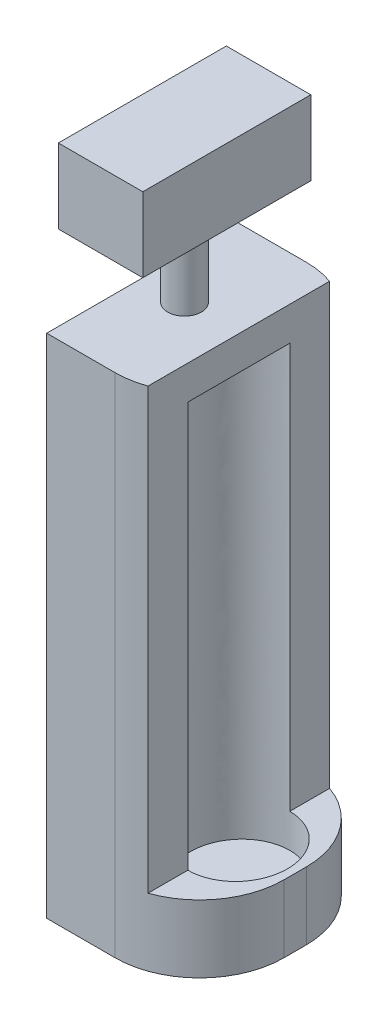
ISO-10303-21;
HEADER;
FILE_DESCRIPTION(('STEP AP214'),'2;1');
FILE_NAME('part.step','',(''),(''),'','','');
FILE_SCHEMA(('AUTOMOTIVE_DESIGN { 1 0 10303 214 1 1 1 1 }'));
ENDSEC;
DATA;
#1=APPLICATION_CONTEXT('core data for automotive mechanical design processes');
#2=APPLICATION_PROTOCOL_DEFINITION('international standard','automotive_design',2000,#1);
#3=PRODUCT_CONTEXT('',#1,'mechanical');
#4=PRODUCT('Part','Part','',(#3));
#5=PRODUCT_RELATED_PRODUCT_CATEGORY('part','',(#4));
#6=PRODUCT_DEFINITION_FORMATION('','',#4);
#7=PRODUCT_DEFINITION_CONTEXT('part definition',#1,'design');
#8=PRODUCT_DEFINITION('design','',#6,#7);
#9=PRODUCT_DEFINITION_SHAPE('','',#8);
#10=(LENGTH_UNIT() NAMED_UNIT(*) SI_UNIT(.MILLI.,.METRE.));
#11=(NAMED_UNIT(*) PLANE_ANGLE_UNIT() SI_UNIT($,.RADIAN.));
#12=(NAMED_UNIT(*) SI_UNIT($,.STERADIAN.) SOLID_ANGLE_UNIT());
#13=UNCERTAINTY_MEASURE_WITH_UNIT(LENGTH_MEASURE(1.E-05),#10,'distance_accuracy_value','');
#14=(GEOMETRIC_REPRESENTATION_CONTEXT(3) GLOBAL_UNCERTAINTY_ASSIGNED_CONTEXT((#13)) GLOBAL_UNIT_ASSIGNED_CONTEXT((#10,
#11,#12)) REPRESENTATION_CONTEXT('',''));
#15=CARTESIAN_POINT('',(0.,0.,0.));
#16=DIRECTION('',(0.,0.,1.));
#17=DIRECTION('',(1.,0.,0.));
#18=AXIS2_PLACEMENT_3D('',#15,#16,#17);
#19=CARTESIAN_POINT('',(12.7376269761998,-11.1395787251663,25.5353749424132));
#20=DIRECTION('',(0.,1.,0.));
#21=DIRECTION('',(0.,0.,1.));
#22=AXIS2_PLACEMENT_3D('',#19,#20,#21);
#23=PLANE('',#22);
#24=CARTESIAN_POINT('',(12.7376269761998,-11.1395787251663,25.5353749424132));
#25=DIRECTION('',(0.,1.,0.));
#26=DIRECTION('',(0.,0.,-1.));
#27=AXIS2_PLACEMENT_3D('',#24,#25,#26);
#28=ELLIPSE('',#27,6.03652419718227,5.75939601665254);
#29=CARTESIAN_POINT('',(12.7376269761998,-11.1395787251663,19.4988507452309));
#30=VERTEX_POINT('',#29);
#31=EDGE_CURVE('E249',#30,#30,#28,.T.);
#32=ORIENTED_EDGE('',*,*,#31,.T.);
#33=EDGE_LOOP('',(#32));
#34=FACE_BOUND('',#33,.T.);
#35=ADVANCED_FACE('F44',(#34),#23,.T.);
#36=CARTESIAN_POINT('',(12.7376269761998,40.8604212748337,25.5353749424132));
#37=DIRECTION('',(0.,1.,0.));
#38=DIRECTION('',(0.,0.,1.));
#39=AXIS2_PLACEMENT_3D('',#36,#37,#38);
#40=PLANE('',#39);
#41=CARTESIAN_POINT('',(12.7376269761998,40.8604212748337,25.5353749424132));
#42=DIRECTION('',(0.,1.,0.));
#43=DIRECTION('',(0.,0.,-1.));
#44=AXIS2_PLACEMENT_3D('',#41,#42,#43);
#45=ELLIPSE('',#44,6.03652419718227,5.75939601665254);
#46=CARTESIAN_POINT('',(12.7376269761998,40.8604212748337,19.4988507452309));
#47=VERTEX_POINT('',#46);
#48=CARTESIAN_POINT('',(12.7376269761998,40.8604212748337,31.5718991395954));
#49=VERTEX_POINT('',#48);
#50=EDGE_CURVE('E246',#47,#49,#45,.T.);
#51=ORIENTED_EDGE('',*,*,#50,.F.);
#52=DIRECTION('',(0.,0.,-1.));
#53=VECTOR('',#52,1.);
#54=CARTESIAN_POINT('',(12.7376269761998,40.8604212748337,14.2141297488099));
#55=LINE('',#54,#53);
#56=EDGE_CURVE('E197',#49,#47,#55,.T.);
#57=ORIENTED_EDGE('',*,*,#56,.F.);
#58=EDGE_LOOP('',(#51,#57));
#59=FACE_BOUND('',#58,.T.);
#60=ADVANCED_FACE('F263',(#59),#40,.F.);
#61=DIRECTION('',(0.,-1.,0.));
#62=VECTOR('',#61,1.);
#63=SURFACE_OF_LINEAR_EXTRUSION('',#45,#62);
#64=ORIENTED_EDGE('',*,*,#31,.F.);
#65=EDGE_LOOP('',(#64));
#66=FACE_BOUND('',#65,.T.);
#67=ORIENTED_EDGE('',*,*,#50,.T.);
#68=DIRECTION('',(0.,-1.,0.));
#69=VECTOR('',#68,1.);
#70=CARTESIAN_POINT('',(12.7376269761998,40.307764042365,31.5718991395954));
#71=LINE('',#70,#69);
#72=CARTESIAN_POINT('',(12.7376269761998,-7.1395787251663,31.5718991395954));
#73=VERTEX_POINT('',#72);
#74=EDGE_CURVE('E243',#49,#73,#71,.T.);
#75=ORIENTED_EDGE('',*,*,#74,.T.);
#76=CARTESIAN_POINT('',(12.7376269761998,-7.1395787251663,25.5353749424132));
#77=DIRECTION('',(0.,1.,0.));
#78=DIRECTION('',(0.,0.,-1.));
#79=AXIS2_PLACEMENT_3D('',#76,#77,#78);
#80=ELLIPSE('',#79,6.03652419718227,5.75939601665254);
#81=CARTESIAN_POINT('',(12.7376269761998,-7.1395787251663,19.4988507452309));
#82=VERTEX_POINT('',#81);
#83=EDGE_CURVE('E241',#82,#73,#80,.F.);
#84=ORIENTED_EDGE('',*,*,#83,.F.);
#85=DIRECTION('',(0.,1.,0.));
#86=VECTOR('',#85,1.);
#87=CARTESIAN_POINT('',(12.7376269761998,40.307764042365,19.4988507452309));
#88=LINE('',#87,#86);
#89=EDGE_CURVE('E90',#82,#47,#88,.T.);
#90=ORIENTED_EDGE('',*,*,#89,.T.);
#91=EDGE_LOOP('',(#67,#75,#84,#90));
#92=FACE_BOUND('',#91,.T.);
#93=ADVANCED_FACE('F258',(#66,#92),#63,.T.);
#94=CARTESIAN_POINT('',(-6.68122287782023,-7.1395787251663,-25.5355796344289));
#95=DIRECTION('',(0.,1.,0.));
#96=DIRECTION('',(0.,0.,1.));
#97=AXIS2_PLACEMENT_3D('',#94,#95,#96);
#98=PLANE('',#97);
#99=DIRECTION('',(0.,0.,1.));
#100=VECTOR('',#99,1.);
#101=CARTESIAN_POINT('',(12.7376269761998,-7.1395787251663,14.2141297488099));
#102=LINE('',#101,#100);
#103=CARTESIAN_POINT('',(12.7376269761998,-7.1395787251663,14.783571741652));
#104=VERTEX_POINT('',#103);
#105=EDGE_CURVE('E237',#104,#82,#102,.T.);
#106=ORIENTED_EDGE('',*,*,#105,.T.);
#107=ORIENTED_EDGE('',*,*,#83,.T.);
#108=CARTESIAN_POINT('',(12.7376269761998,-7.1395787251663,36.2871781431744));
#109=VERTEX_POINT('',#108);
#110=EDGE_CURVE('E242',#73,#109,#102,.T.);
#111=ORIENTED_EDGE('',*,*,#110,.T.);
#112=CARTESIAN_POINT('',(9.41128128255495,-7.1395787251663,26.8566201360165));
#113=DIRECTION('',(0.,1.,0.));
#114=DIRECTION('',(0.,0.,1.));
#115=AXIS2_PLACEMENT_3D('',#112,#113,#114);
#116=CIRCLE('',#115,10.);
#117=CARTESIAN_POINT('',(19.4112812825549,-7.1395787251663,26.8566201360165));
#118=VERTEX_POINT('',#117);
#119=EDGE_CURVE('E178',#118,#109,#116,.F.);
#120=ORIENTED_EDGE('',*,*,#119,.F.);
#121=DIRECTION('',(0.,0.,1.));
#122=VECTOR('',#121,1.);
#123=CARTESIAN_POINT('',(19.4112812825549,-7.1395787251663,14.2141297488099));
#124=LINE('',#123,#122);
#125=CARTESIAN_POINT('',(19.4112812825549,-7.1395787251663,24.2141297488099));
#126=VERTEX_POINT('',#125);
#127=EDGE_CURVE('E233',#126,#118,#124,.T.);
#128=ORIENTED_EDGE('',*,*,#127,.F.);
#129=CARTESIAN_POINT('',(9.41128128255495,-7.1395787251663,24.2141297488099));
#130=DIRECTION('',(0.,1.,0.));
#131=DIRECTION('',(0.,0.,1.));
#132=AXIS2_PLACEMENT_3D('',#129,#130,#131);
#133=CIRCLE('',#132,10.);
#134=EDGE_CURVE('E217',#104,#126,#133,.F.);
#135=ORIENTED_EDGE('',*,*,#134,.F.);
#136=EDGE_LOOP('',(#106,#107,#111,#120,#128,#135));
#137=FACE_BOUND('',#136,.T.);
#138=ADVANCED_FACE('F262',(#137),#98,.T.);
#139=CARTESIAN_POINT('',(12.7376269761998,-7.1395787251663,14.2141297488099));
#140=DIRECTION('',(-1.,0.,0.));
#141=DIRECTION('',(0.,0.,1.));
#142=AXIS2_PLACEMENT_3D('',#139,#140,#141);
#143=PLANE('',#142);
#144=ORIENTED_EDGE('',*,*,#74,.F.);
#145=ORIENTED_EDGE('',*,*,#56,.T.);
#146=ORIENTED_EDGE('',*,*,#89,.F.);
#147=ORIENTED_EDGE('',*,*,#105,.F.);
#148=DIRECTION('',(0.,-1.,0.));
#149=VECTOR('',#148,1.);
#150=CARTESIAN_POINT('',(12.7376269761998,44.8604212748337,14.783571741652));
#151=LINE('',#150,#149);
#152=CARTESIAN_POINT('',(12.7376269761998,44.8604212748337,14.783571741652));
#153=VERTEX_POINT('',#152);
#154=EDGE_CURVE('E225',#104,#153,#151,.F.);
#155=ORIENTED_EDGE('',*,*,#154,.T.);
#156=DIRECTION('',(0.,0.,1.));
#157=VECTOR('',#156,1.);
#158=CARTESIAN_POINT('',(12.7376269761998,44.8604212748337,-25.5355796344289));
#159=LINE('',#158,#157);
#160=CARTESIAN_POINT('',(12.7376269761998,44.8604212748337,36.2871781431744));
#161=VERTEX_POINT('',#160);
#162=EDGE_CURVE('E228',#153,#161,#159,.T.);
#163=ORIENTED_EDGE('',*,*,#162,.T.);
#164=DIRECTION('',(0.,1.,0.));
#165=VECTOR('',#164,1.);
#166=CARTESIAN_POINT('',(12.7376269761998,44.8604212748337,36.2871781431744));
#167=LINE('',#166,#165);
#168=EDGE_CURVE('E229',#161,#109,#167,.F.);
#169=ORIENTED_EDGE('',*,*,#168,.T.);
#170=ORIENTED_EDGE('',*,*,#110,.F.);
#171=EDGE_LOOP('',(#144,#145,#146,#147,#155,#163,#169,#170));
#172=FACE_BOUND('',#171,.T.);
#173=ADVANCED_FACE('F289',(#172),#143,.F.);
#174=CARTESIAN_POINT('',(11.3187771221798,-19.1395787251663,-25.5355796344289));
#175=DIRECTION('',(1.,0.,0.));
#176=DIRECTION('',(0.,0.,-1.));
#177=AXIS2_PLACEMENT_3D('',#174,#175,#176);
#178=PLANE('',#177);
#179=DIRECTION('',(0.,1.,0.));
#180=VECTOR('',#179,1.);
#181=CARTESIAN_POINT('',(11.3187771221798,63.674764876525,15.5915815513495));
#182=LINE('',#181,#180);
#183=CARTESIAN_POINT('',(11.3187771221798,54.8530313037172,15.5915815513495));
#184=VERTEX_POINT('',#183);
#185=CARTESIAN_POINT('',(11.3187771221798,63.674764876525,15.5915815513495));
#186=VERTEX_POINT('',#185);
#187=EDGE_CURVE('E299',#184,#186,#182,.T.);
#188=ORIENTED_EDGE('',*,*,#187,.T.);
#189=DIRECTION('',(0.,0.,1.));
#190=VECTOR('',#189,1.);
#191=CARTESIAN_POINT('',(11.3187771221798,63.674764876525,35.4791683334768));
#192=LINE('',#191,#190);
#193=CARTESIAN_POINT('',(11.3187771221798,63.674764876525,35.4791683334768));
#194=VERTEX_POINT('',#193);
#195=EDGE_CURVE('E72',#186,#194,#192,.T.);
#196=ORIENTED_EDGE('',*,*,#195,.T.);
#197=DIRECTION('',(0.,-1.,0.));
#198=VECTOR('',#197,1.);
#199=CARTESIAN_POINT('',(11.3187771221798,63.674764876525,35.4791683334768));
#200=LINE('',#199,#198);
#201=CARTESIAN_POINT('',(11.3187771221798,54.8530313037172,35.4791683334768));
#202=VERTEX_POINT('',#201);
#203=EDGE_CURVE('E332',#194,#202,#200,.T.);
#204=ORIENTED_EDGE('',*,*,#203,.T.);
#205=DIRECTION('',(0.,0.,-1.));
#206=VECTOR('',#205,1.);
#207=CARTESIAN_POINT('',(11.3187771221798,54.8530313037172,35.4791683334768));
#208=LINE('',#207,#206);
#209=EDGE_CURVE('E63',#202,#184,#208,.T.);
#210=ORIENTED_EDGE('',*,*,#209,.T.);
#211=EDGE_LOOP('',(#188,#196,#204,#210));
#212=FACE_BOUND('',#211,.T.);
#213=ADVANCED_FACE('F286',(#212),#178,.T.);
#214=CARTESIAN_POINT('',(9.41128128255495,44.8604212748337,26.8566201360165));
#215=DIRECTION('',(0.,1.,0.));
#216=DIRECTION('',(0.,0.,1.));
#217=AXIS2_PLACEMENT_3D('',#214,#215,#216);
#218=CYLINDRICAL_SURFACE('',#217,10.);
#219=ORIENTED_EDGE('',*,*,#168,.F.);
#220=CARTESIAN_POINT('',(9.41128128255495,44.8604212748337,26.8566201360165));
#221=DIRECTION('',(0.,1.,0.));
#222=DIRECTION('',(0.,0.,1.));
#223=AXIS2_PLACEMENT_3D('',#220,#221,#222);
#224=CIRCLE('',#223,10.);
#225=CARTESIAN_POINT('',(9.41128128255495,44.8604212748337,36.8566201360165));
#226=VERTEX_POINT('',#225);
#227=EDGE_CURVE('E214',#226,#161,#224,.T.);
#228=ORIENTED_EDGE('',*,*,#227,.F.);
#229=DIRECTION('',(0.,1.,0.));
#230=VECTOR('',#229,1.);
#231=CARTESIAN_POINT('',(9.41128128255495,44.8604212748337,36.8566201360165));
#232=LINE('',#231,#230);
#233=CARTESIAN_POINT('',(9.41128128255495,-15.1395787251663,36.8566201360165));
#234=VERTEX_POINT('',#233);
#235=EDGE_CURVE('E177',#234,#226,#232,.T.);
#236=ORIENTED_EDGE('',*,*,#235,.F.);
#237=CARTESIAN_POINT('',(9.41128128255495,-15.1395787251663,26.8566201360165));
#238=DIRECTION('',(0.,1.,0.));
#239=DIRECTION('',(0.,0.,1.));
#240=AXIS2_PLACEMENT_3D('',#237,#238,#239);
#241=CIRCLE('',#240,10.);
#242=CARTESIAN_POINT('',(19.4112812825549,-15.1395787251663,26.8566201360165));
#243=VERTEX_POINT('',#242);
#244=EDGE_CURVE('E172',#234,#243,#241,.T.);
#245=ORIENTED_EDGE('',*,*,#244,.T.);
#246=DIRECTION('',(0.,1.,0.));
#247=VECTOR('',#246,1.);
#248=CARTESIAN_POINT('',(19.4112812825549,44.8604212748337,26.8566201360165));
#249=LINE('',#248,#247);
#250=EDGE_CURVE('E205',#118,#243,#249,.F.);
#251=ORIENTED_EDGE('',*,*,#250,.F.);
#252=ORIENTED_EDGE('',*,*,#119,.T.);
#253=EDGE_LOOP('',(#219,#228,#236,#245,#251,#252));
#254=FACE_BOUND('',#253,.T.);
#255=ADVANCED_FACE('F288',(#254),#218,.T.);
#256=CARTESIAN_POINT('',(19.4112812825549,44.8604212748337,36.8566201360165));
#257=DIRECTION('',(-1.,0.,0.));
#258=DIRECTION('',(0.,0.,1.));
#259=AXIS2_PLACEMENT_3D('',#256,#257,#258);
#260=PLANE('',#259);
#261=ORIENTED_EDGE('',*,*,#127,.T.);
#262=ORIENTED_EDGE('',*,*,#250,.T.);
#263=DIRECTION('',(0.,0.,-1.));
#264=VECTOR('',#263,1.);
#265=CARTESIAN_POINT('',(19.4112812825549,-15.1395787251663,36.8566201360165));
#266=LINE('',#265,#264);
#267=CARTESIAN_POINT('',(19.4112812825549,-15.1395787251663,24.2141297488099));
#268=VERTEX_POINT('',#267);
#269=EDGE_CURVE('E201',#243,#268,#266,.T.);
#270=ORIENTED_EDGE('',*,*,#269,.T.);
#271=DIRECTION('',(0.,-1.,0.));
#272=VECTOR('',#271,1.);
#273=CARTESIAN_POINT('',(19.4112812825549,44.8604212748337,24.2141297488099));
#274=LINE('',#273,#272);
#275=EDGE_CURVE('E204',#268,#126,#274,.F.);
#276=ORIENTED_EDGE('',*,*,#275,.T.);
#277=EDGE_LOOP('',(#261,#262,#270,#276));
#278=FACE_BOUND('',#277,.T.);
#279=ADVANCED_FACE('F294',(#278),#260,.F.);
#280=CARTESIAN_POINT('',(9.41128128255495,44.8604212748337,24.2141297488099));
#281=DIRECTION('',(0.,-1.,0.));
#282=DIRECTION('',(0.,0.,-1.));
#283=AXIS2_PLACEMENT_3D('',#280,#281,#282);
#284=CYLINDRICAL_SURFACE('',#283,10.);
#285=ORIENTED_EDGE('',*,*,#154,.F.);
#286=ORIENTED_EDGE('',*,*,#134,.T.);
#287=ORIENTED_EDGE('',*,*,#275,.F.);
#288=CARTESIAN_POINT('',(9.41128128255495,-15.1395787251663,24.2141297488099));
#289=DIRECTION('',(0.,1.,0.));
#290=DIRECTION('',(0.,0.,1.));
#291=AXIS2_PLACEMENT_3D('',#288,#289,#290);
#292=CIRCLE('',#291,10.);
#293=CARTESIAN_POINT('',(9.41128128255495,-15.1395787251663,14.2141297488099));
#294=VERTEX_POINT('',#293);
#295=EDGE_CURVE('E221',#268,#294,#292,.T.);
#296=ORIENTED_EDGE('',*,*,#295,.T.);
#297=DIRECTION('',(0.,-1.,0.));
#298=VECTOR('',#297,1.);
#299=CARTESIAN_POINT('',(9.41128128255495,44.8604212748337,14.2141297488099));
#300=LINE('',#299,#298);
#301=CARTESIAN_POINT('',(9.41128128255495,44.8604212748337,14.2141297488099));
#302=VERTEX_POINT('',#301);
#303=EDGE_CURVE('E185',#302,#294,#300,.T.);
#304=ORIENTED_EDGE('',*,*,#303,.F.);
#305=CARTESIAN_POINT('',(9.41128128255495,44.8604212748337,24.2141297488099));
#306=DIRECTION('',(0.,1.,0.));
#307=DIRECTION('',(0.,0.,1.));
#308=AXIS2_PLACEMENT_3D('',#305,#306,#307);
#309=CIRCLE('',#308,10.);
#310=EDGE_CURVE('E200',#153,#302,#309,.T.);
#311=ORIENTED_EDGE('',*,*,#310,.F.);
#312=EDGE_LOOP('',(#285,#286,#287,#296,#304,#311));
#313=FACE_BOUND('',#312,.T.);
#314=ADVANCED_FACE('F356',(#313),#284,.T.);
#315=CARTESIAN_POINT('',(-26.6613387470308,-15.1395787251663,38.9216194809833));
#316=DIRECTION('',(0.,1.,0.));
#317=DIRECTION('',(0.,0.,1.));
#318=AXIS2_PLACEMENT_3D('',#315,#316,#317);
#319=PLANE('',#318);
#320=DIRECTION('',(0.,0.,-1.));
#321=VECTOR('',#320,1.);
#322=CARTESIAN_POINT('',(1.31877712217975,-15.1395787251663,38.9216194809833));
#323=LINE('',#322,#321);
#324=CARTESIAN_POINT('',(1.31877712217975,-15.1395787251663,36.8566201360165));
#325=VERTEX_POINT('',#324);
#326=CARTESIAN_POINT('',(1.31877712217975,-15.1395787251663,14.2141297488099));
#327=VERTEX_POINT('',#326);
#328=EDGE_CURVE('E156',#325,#327,#323,.T.);
#329=ORIENTED_EDGE('',*,*,#328,.T.);
#330=DIRECTION('',(-1.,0.,0.));
#331=VECTOR('',#330,1.);
#332=CARTESIAN_POINT('',(19.4112812825549,-15.1395787251663,14.2141297488099));
#333=LINE('',#332,#331);
#334=EDGE_CURVE('E190',#294,#327,#333,.T.);
#335=ORIENTED_EDGE('',*,*,#334,.F.);
#336=ORIENTED_EDGE('',*,*,#295,.F.);
#337=ORIENTED_EDGE('',*,*,#269,.F.);
#338=ORIENTED_EDGE('',*,*,#244,.F.);
#339=DIRECTION('',(1.,0.,0.));
#340=VECTOR('',#339,1.);
#341=CARTESIAN_POINT('',(19.4112812825549,-15.1395787251663,36.8566201360165));
#342=LINE('',#341,#340);
#343=EDGE_CURVE('E169',#325,#234,#342,.T.);
#344=ORIENTED_EDGE('',*,*,#343,.F.);
#345=EDGE_LOOP('',(#329,#335,#336,#337,#338,#344));
#346=FACE_BOUND('',#345,.T.);
#347=ADVANCED_FACE('F170',(#346),#319,.F.);
#348=CARTESIAN_POINT('',(-6.68122287782023,44.8604212748337,-25.5355796344289));
#349=DIRECTION('',(0.,1.,0.));
#350=DIRECTION('',(0.,0.,1.));
#351=AXIS2_PLACEMENT_3D('',#348,#349,#350);
#352=PLANE('',#351);
#353=CARTESIAN_POINT('',(6.31877712217975,44.8604212748337,25.5353749424132));
#354=DIRECTION('',(0.,1.,0.));
#355=DIRECTION('',(0.,0.,1.));
#356=AXIS2_PLACEMENT_3D('',#353,#354,#355);
#357=CIRCLE('',#356,2.);
#358=CARTESIAN_POINT('',(6.31877712217975,44.8604212748337,27.5353749424132));
#359=VERTEX_POINT('',#358);
#360=EDGE_CURVE('E48',#359,#359,#357,.T.);
#361=ORIENTED_EDGE('',*,*,#360,.F.);
#362=EDGE_LOOP('',(#361));
#363=FACE_BOUND('',#362,.T.);
#364=ORIENTED_EDGE('',*,*,#162,.F.);
#365=ORIENTED_EDGE('',*,*,#310,.T.);
#366=DIRECTION('',(-1.,0.,0.));
#367=VECTOR('',#366,1.);
#368=CARTESIAN_POINT('',(19.4112812825549,44.8604212748337,14.2141297488099));
#369=LINE('',#368,#367);
#370=CARTESIAN_POINT('',(1.31877712217975,44.8604212748337,14.2141297488099));
#371=VERTEX_POINT('',#370);
#372=EDGE_CURVE('E207',#302,#371,#369,.T.);
#373=ORIENTED_EDGE('',*,*,#372,.T.);
#374=DIRECTION('',(0.,0.,1.));
#375=VECTOR('',#374,1.);
#376=CARTESIAN_POINT('',(1.31877712217975,44.8604212748337,36.8566201360165));
#377=LINE('',#376,#375);
#378=CARTESIAN_POINT('',(1.31877712217975,44.8604212748337,36.8566201360165));
#379=VERTEX_POINT('',#378);
#380=EDGE_CURVE('E211',#371,#379,#377,.T.);
#381=ORIENTED_EDGE('',*,*,#380,.T.);
#382=DIRECTION('',(1.,0.,0.));
#383=VECTOR('',#382,1.);
#384=CARTESIAN_POINT('',(19.4112812825549,44.8604212748337,36.8566201360165));
#385=LINE('',#384,#383);
#386=EDGE_CURVE('E182',#379,#226,#385,.T.);
#387=ORIENTED_EDGE('',*,*,#386,.T.);
#388=ORIENTED_EDGE('',*,*,#227,.T.);
#389=EDGE_LOOP('',(#364,#365,#373,#381,#387,#388));
#390=FACE_BOUND('',#389,.T.);
#391=ADVANCED_FACE('F342',(#363,#390),#352,.T.);
#392=CARTESIAN_POINT('',(19.4112812825549,44.8604212748337,14.2141297488099));
#393=DIRECTION('',(0.,0.,1.));
#394=DIRECTION('',(1.,0.,0.));
#395=AXIS2_PLACEMENT_3D('',#392,#393,#394);
#396=PLANE('',#395);
#397=ORIENTED_EDGE('',*,*,#372,.F.);
#398=ORIENTED_EDGE('',*,*,#303,.T.);
#399=ORIENTED_EDGE('',*,*,#334,.T.);
#400=DIRECTION('',(0.,-1.,0.));
#401=VECTOR('',#400,1.);
#402=CARTESIAN_POINT('',(1.31877712217975,44.8604212748337,14.2141297488099));
#403=LINE('',#402,#401);
#404=EDGE_CURVE('E163',#371,#327,#403,.T.);
#405=ORIENTED_EDGE('',*,*,#404,.F.);
#406=EDGE_LOOP('',(#397,#398,#399,#405));
#407=FACE_BOUND('',#406,.T.);
#408=ADVANCED_FACE('F345',(#407),#396,.F.);
#409=CARTESIAN_POINT('',(19.4112812825549,44.8604212748337,36.8566201360165));
#410=DIRECTION('',(0.,0.,-1.));
#411=DIRECTION('',(-1.,0.,0.));
#412=AXIS2_PLACEMENT_3D('',#409,#410,#411);
#413=PLANE('',#412);
#414=ORIENTED_EDGE('',*,*,#343,.T.);
#415=ORIENTED_EDGE('',*,*,#235,.T.);
#416=ORIENTED_EDGE('',*,*,#386,.F.);
#417=DIRECTION('',(0.,-1.,0.));
#418=VECTOR('',#417,1.);
#419=CARTESIAN_POINT('',(1.31877712217975,44.8604212748337,36.8566201360165));
#420=LINE('',#419,#418);
#421=EDGE_CURVE('E160',#379,#325,#420,.T.);
#422=ORIENTED_EDGE('',*,*,#421,.T.);
#423=EDGE_LOOP('',(#414,#415,#416,#422));
#424=FACE_BOUND('',#423,.T.);
#425=ADVANCED_FACE('F180',(#424),#413,.F.);
#426=CARTESIAN_POINT('',(6.31877712217975,-19.1435787251663,25.5353749424132));
#427=DIRECTION('',(0.,1.,0.));
#428=DIRECTION('',(0.,0.,1.));
#429=AXIS2_PLACEMENT_3D('',#426,#427,#428);
#430=CYLINDRICAL_SURFACE('',#429,2.);
#431=ORIENTED_EDGE('',*,*,#360,.T.);
#432=EDGE_LOOP('',(#431));
#433=FACE_BOUND('',#432,.T.);
#434=CARTESIAN_POINT('',(6.31877712217975,54.8530313037172,25.5353749424132));
#435=DIRECTION('',(0.,1.,0.));
#436=DIRECTION('',(0.,0.,1.));
#437=AXIS2_PLACEMENT_3D('',#434,#435,#436);
#438=CIRCLE('',#437,2.);
#439=CARTESIAN_POINT('',(6.31877712217975,54.8530313037172,27.5353749424132));
#440=VERTEX_POINT('',#439);
#441=EDGE_CURVE('E11',#440,#440,#438,.F.);
#442=ORIENTED_EDGE('',*,*,#441,.T.);
#443=EDGE_LOOP('',(#442));
#444=FACE_BOUND('',#443,.T.);
#445=ADVANCED_FACE('F46',(#433,#444),#430,.T.);
#446=CARTESIAN_POINT('',(11.3187771221798,54.8530313037172,35.4791683334768));
#447=DIRECTION('',(0.,1.,0.));
#448=DIRECTION('',(0.,0.,1.));
#449=AXIS2_PLACEMENT_3D('',#446,#447,#448);
#450=PLANE('',#449);
#451=ORIENTED_EDGE('',*,*,#441,.F.);
#452=EDGE_LOOP('',(#451));
#453=FACE_BOUND('',#452,.T.);
#454=DIRECTION('',(0.,0.,-1.));
#455=VECTOR('',#454,1.);
#456=CARTESIAN_POINT('',(1.31877712217975,54.8530313037172,35.4791683334768));
#457=LINE('',#456,#455);
#458=CARTESIAN_POINT('',(1.31877712217975,54.8530313037172,35.4791683334768));
#459=VERTEX_POINT('',#458);
#460=CARTESIAN_POINT('',(1.31877712217975,54.8530313037172,15.5915815513495));
#461=VERTEX_POINT('',#460);
#462=EDGE_CURVE('E320',#459,#461,#457,.T.);
#463=ORIENTED_EDGE('',*,*,#462,.T.);
#464=DIRECTION('',(-1.,0.,0.));
#465=VECTOR('',#464,1.);
#466=CARTESIAN_POINT('',(11.3187771221798,54.8530313037172,15.5915815513495));
#467=LINE('',#466,#465);
#468=EDGE_CURVE('E314',#184,#461,#467,.T.);
#469=ORIENTED_EDGE('',*,*,#468,.F.);
#470=ORIENTED_EDGE('',*,*,#209,.F.);
#471=DIRECTION('',(-1.,0.,0.));
#472=VECTOR('',#471,1.);
#473=CARTESIAN_POINT('',(11.3187771221798,54.8530313037172,35.4791683334768));
#474=LINE('',#473,#472);
#475=EDGE_CURVE('E303',#202,#459,#474,.T.);
#476=ORIENTED_EDGE('',*,*,#475,.T.);
#477=EDGE_LOOP('',(#463,#469,#470,#476));
#478=FACE_BOUND('',#477,.T.);
#479=ADVANCED_FACE('F282',(#453,#478),#450,.F.);
#480=CARTESIAN_POINT('',(11.3187771221798,63.674764876525,35.4791683334768));
#481=DIRECTION('',(0.,0.,-1.));
#482=DIRECTION('',(-1.,0.,0.));
#483=AXIS2_PLACEMENT_3D('',#480,#481,#482);
#484=PLANE('',#483);
#485=DIRECTION('',(0.,-1.,0.));
#486=VECTOR('',#485,1.);
#487=CARTESIAN_POINT('',(1.31877712217975,63.674764876525,35.4791683334768));
#488=LINE('',#487,#486);
#489=CARTESIAN_POINT('',(1.31877712217975,63.674764876525,35.4791683334768));
#490=VERTEX_POINT('',#489);
#491=EDGE_CURVE('E307',#490,#459,#488,.T.);
#492=ORIENTED_EDGE('',*,*,#491,.T.);
#493=ORIENTED_EDGE('',*,*,#475,.F.);
#494=ORIENTED_EDGE('',*,*,#203,.F.);
#495=DIRECTION('',(-1.,0.,0.));
#496=VECTOR('',#495,1.);
#497=CARTESIAN_POINT('',(11.3187771221798,63.674764876525,35.4791683334768));
#498=LINE('',#497,#496);
#499=EDGE_CURVE('E312',#194,#490,#498,.T.);
#500=ORIENTED_EDGE('',*,*,#499,.T.);
#501=EDGE_LOOP('',(#492,#493,#494,#500));
#502=FACE_BOUND('',#501,.T.);
#503=ADVANCED_FACE('F279',(#502),#484,.F.);
#504=CARTESIAN_POINT('',(11.3187771221798,63.674764876525,35.4791683334768));
#505=DIRECTION('',(0.,-1.,0.));
#506=DIRECTION('',(0.,0.,-1.));
#507=AXIS2_PLACEMENT_3D('',#504,#505,#506);
#508=PLANE('',#507);
#509=DIRECTION('',(0.,0.,1.));
#510=VECTOR('',#509,1.);
#511=CARTESIAN_POINT('',(1.31877712217975,63.674764876525,35.4791683334768));
#512=LINE('',#511,#510);
#513=CARTESIAN_POINT('',(1.31877712217975,63.674764876525,15.5915815513495));
#514=VERTEX_POINT('',#513);
#515=EDGE_CURVE('E308',#514,#490,#512,.T.);
#516=ORIENTED_EDGE('',*,*,#515,.T.);
#517=ORIENTED_EDGE('',*,*,#499,.F.);
#518=ORIENTED_EDGE('',*,*,#195,.F.);
#519=DIRECTION('',(-1.,0.,0.));
#520=VECTOR('',#519,1.);
#521=CARTESIAN_POINT('',(11.3187771221798,63.674764876525,15.5915815513495));
#522=LINE('',#521,#520);
#523=EDGE_CURVE('E304',#186,#514,#522,.T.);
#524=ORIENTED_EDGE('',*,*,#523,.T.);
#525=EDGE_LOOP('',(#516,#517,#518,#524));
#526=FACE_BOUND('',#525,.T.);
#527=ADVANCED_FACE('F275',(#526),#508,.F.);
#528=CARTESIAN_POINT('',(11.3187771221798,63.674764876525,15.5915815513495));
#529=DIRECTION('',(0.,0.,1.));
#530=DIRECTION('',(1.,0.,0.));
#531=AXIS2_PLACEMENT_3D('',#528,#529,#530);
#532=PLANE('',#531);
#533=DIRECTION('',(0.,1.,0.));
#534=VECTOR('',#533,1.);
#535=CARTESIAN_POINT('',(1.31877712217975,63.674764876525,15.5915815513495));
#536=LINE('',#535,#534);
#537=EDGE_CURVE('E79',#461,#514,#536,.T.);
#538=ORIENTED_EDGE('',*,*,#537,.T.);
#539=ORIENTED_EDGE('',*,*,#523,.F.);
#540=ORIENTED_EDGE('',*,*,#187,.F.);
#541=ORIENTED_EDGE('',*,*,#468,.T.);
#542=EDGE_LOOP('',(#538,#539,#540,#541));
#543=FACE_BOUND('',#542,.T.);
#544=ADVANCED_FACE('F272',(#543),#532,.F.);
#545=CARTESIAN_POINT('',(1.31877712217975,-46.5160397426975,11.2288968980655));
#546=DIRECTION('',(1.,0.,0.));
#547=DIRECTION('',(0.,0.,-1.));
#548=AXIS2_PLACEMENT_3D('',#545,#546,#547);
#549=PLANE('',#548);
#550=ORIENTED_EDGE('',*,*,#380,.F.);
#551=ORIENTED_EDGE('',*,*,#404,.T.);
#552=ORIENTED_EDGE('',*,*,#328,.F.);
#553=ORIENTED_EDGE('',*,*,#421,.F.);
#554=EDGE_LOOP('',(#550,#551,#552,#553));
#555=FACE_BOUND('',#554,.T.);
#556=ADVANCED_FACE('F158',(#555),#549,.F.);
#557=ORIENTED_EDGE('',*,*,#462,.F.);
#558=ORIENTED_EDGE('',*,*,#491,.F.);
#559=ORIENTED_EDGE('',*,*,#515,.F.);
#560=ORIENTED_EDGE('',*,*,#537,.F.);
#561=EDGE_LOOP('',(#557,#558,#559,#560));
#562=FACE_BOUND('',#561,.T.);
#563=ADVANCED_FACE('F511',(#562),#549,.F.);
#564=CLOSED_SHELL('',(#35,#60,#93,#138,#173,#213,#255,#279,#314,#347,#391,#408,#425,#445,#479,
#503,#527,#544,#556,#563));
#565=MANIFOLD_SOLID_BREP('B2',#564);
#566=ADVANCED_BREP_SHAPE_REPRESENTATION('',(#18,#565),#14);
#567=SHAPE_DEFINITION_REPRESENTATION(#9,#566);
ENDSEC;
END-ISO-10303-21;
